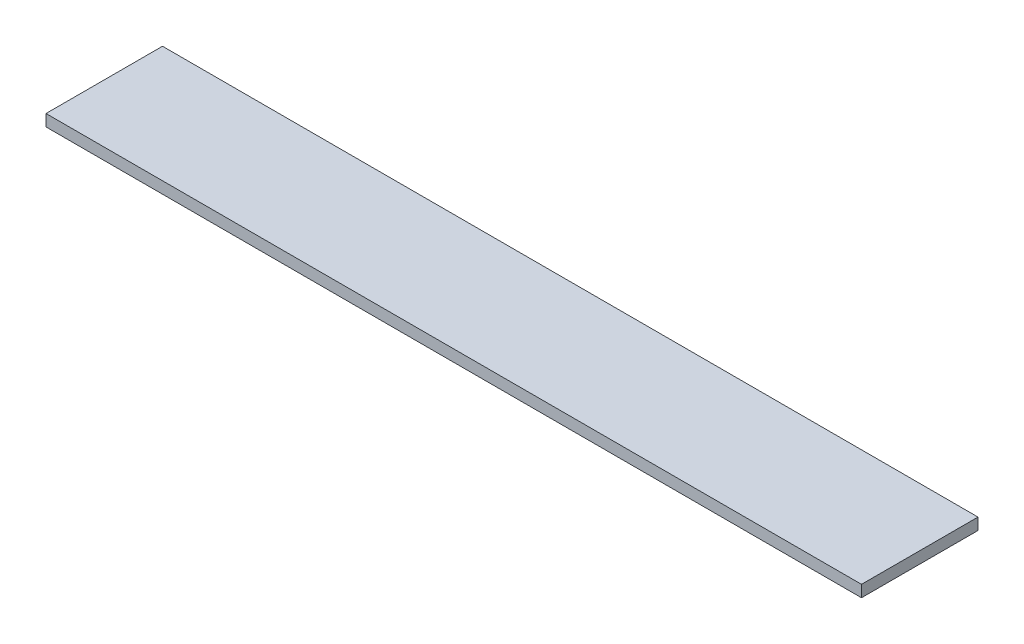
ISO-10303-21;
HEADER;
FILE_DESCRIPTION(('STEP AP214'),'2;1');
FILE_NAME('part.step','',(''),(''),'','','');
FILE_SCHEMA(('AUTOMOTIVE_DESIGN { 1 0 10303 214 1 1 1 1 }'));
ENDSEC;
DATA;
#1=APPLICATION_CONTEXT('core data for automotive mechanical design processes');
#2=APPLICATION_PROTOCOL_DEFINITION('international standard','automotive_design',2000,#1);
#3=PRODUCT_CONTEXT('',#1,'mechanical');
#4=PRODUCT('Part','Part','',(#3));
#5=PRODUCT_RELATED_PRODUCT_CATEGORY('part','',(#4));
#6=PRODUCT_DEFINITION_FORMATION('','',#4);
#7=PRODUCT_DEFINITION_CONTEXT('part definition',#1,'design');
#8=PRODUCT_DEFINITION('design','',#6,#7);
#9=PRODUCT_DEFINITION_SHAPE('','',#8);
#10=(LENGTH_UNIT() NAMED_UNIT(*) SI_UNIT(.MILLI.,.METRE.));
#11=(NAMED_UNIT(*) PLANE_ANGLE_UNIT() SI_UNIT($,.RADIAN.));
#12=(NAMED_UNIT(*) SI_UNIT($,.STERADIAN.) SOLID_ANGLE_UNIT());
#13=UNCERTAINTY_MEASURE_WITH_UNIT(LENGTH_MEASURE(1.E-05),#10,'distance_accuracy_value','');
#14=(GEOMETRIC_REPRESENTATION_CONTEXT(3) GLOBAL_UNCERTAINTY_ASSIGNED_CONTEXT((#13)) GLOBAL_UNIT_ASSIGNED_CONTEXT((#10,
#11,#12)) REPRESENTATION_CONTEXT('',''));
#15=CARTESIAN_POINT('',(0.,0.,0.));
#16=DIRECTION('',(0.,0.,1.));
#17=DIRECTION('',(1.,0.,0.));
#18=AXIS2_PLACEMENT_3D('',#15,#16,#17);
#19=CARTESIAN_POINT('',(-3500.,100.,-500.));
#20=DIRECTION('',(1.,0.,0.));
#21=DIRECTION('',(0.,0.,-1.));
#22=AXIS2_PLACEMENT_3D('',#19,#20,#21);
#23=PLANE('',#22);
#24=DIRECTION('',(0.,0.,1.));
#25=VECTOR('',#24,1.);
#26=CARTESIAN_POINT('',(-3500.,0.,-500.));
#27=LINE('',#26,#25);
#28=CARTESIAN_POINT('',(-3500.,0.,-500.));
#29=VERTEX_POINT('',#28);
#30=CARTESIAN_POINT('',(-3500.,0.,500.));
#31=VERTEX_POINT('',#30);
#32=EDGE_CURVE('E97',#29,#31,#27,.T.);
#33=ORIENTED_EDGE('',*,*,#32,.T.);
#34=DIRECTION('',(0.,-1.,0.));
#35=VECTOR('',#34,1.);
#36=CARTESIAN_POINT('',(-3500.,100.,500.));
#37=LINE('',#36,#35);
#38=CARTESIAN_POINT('',(-3500.,100.,500.));
#39=VERTEX_POINT('',#38);
#40=EDGE_CURVE('E11',#39,#31,#37,.T.);
#41=ORIENTED_EDGE('',*,*,#40,.F.);
#42=DIRECTION('',(0.,0.,1.));
#43=VECTOR('',#42,1.);
#44=CARTESIAN_POINT('',(-3500.,100.,-500.));
#45=LINE('',#44,#43);
#46=CARTESIAN_POINT('',(-3500.,100.,-500.));
#47=VERTEX_POINT('',#46);
#48=EDGE_CURVE('E85',#47,#39,#45,.T.);
#49=ORIENTED_EDGE('',*,*,#48,.F.);
#50=DIRECTION('',(0.,-1.,0.));
#51=VECTOR('',#50,1.);
#52=CARTESIAN_POINT('',(-3500.,100.,-500.));
#53=LINE('',#52,#51);
#54=EDGE_CURVE('E93',#47,#29,#53,.T.);
#55=ORIENTED_EDGE('',*,*,#54,.T.);
#56=EDGE_LOOP('',(#33,#41,#49,#55));
#57=FACE_BOUND('',#56,.T.);
#58=ADVANCED_FACE('F34',(#57),#23,.F.);
#59=CARTESIAN_POINT('',(-3500.,100.,500.));
#60=DIRECTION('',(0.,0.,-1.));
#61=DIRECTION('',(-1.,0.,0.));
#62=AXIS2_PLACEMENT_3D('',#59,#60,#61);
#63=PLANE('',#62);
#64=DIRECTION('',(1.,0.,0.));
#65=VECTOR('',#64,1.);
#66=CARTESIAN_POINT('',(-3500.,0.,500.));
#67=LINE('',#66,#65);
#68=CARTESIAN_POINT('',(3500.,0.,500.));
#69=VERTEX_POINT('',#68);
#70=EDGE_CURVE('E89',#31,#69,#67,.T.);
#71=ORIENTED_EDGE('',*,*,#70,.T.);
#72=DIRECTION('',(0.,-1.,0.));
#73=VECTOR('',#72,1.);
#74=CARTESIAN_POINT('',(3500.,100.,500.));
#75=LINE('',#74,#73);
#76=CARTESIAN_POINT('',(3500.,100.,500.));
#77=VERTEX_POINT('',#76);
#78=EDGE_CURVE('E42',#77,#69,#75,.T.);
#79=ORIENTED_EDGE('',*,*,#78,.F.);
#80=DIRECTION('',(1.,0.,0.));
#81=VECTOR('',#80,1.);
#82=CARTESIAN_POINT('',(-3500.,100.,500.));
#83=LINE('',#82,#81);
#84=EDGE_CURVE('E80',#39,#77,#83,.T.);
#85=ORIENTED_EDGE('',*,*,#84,.F.);
#86=ORIENTED_EDGE('',*,*,#40,.T.);
#87=EDGE_LOOP('',(#71,#79,#85,#86));
#88=FACE_BOUND('',#87,.T.);
#89=ADVANCED_FACE('F88',(#88),#63,.F.);
#90=CARTESIAN_POINT('',(3500.,100.,-500.));
#91=DIRECTION('',(-1.,0.,0.));
#92=DIRECTION('',(0.,0.,1.));
#93=AXIS2_PLACEMENT_3D('',#90,#91,#92);
#94=PLANE('',#93);
#95=DIRECTION('',(0.,0.,-1.));
#96=VECTOR('',#95,1.);
#97=CARTESIAN_POINT('',(3500.,0.,-500.));
#98=LINE('',#97,#96);
#99=CARTESIAN_POINT('',(3500.,0.,-500.));
#100=VERTEX_POINT('',#99);
#101=EDGE_CURVE('E67',#69,#100,#98,.T.);
#102=ORIENTED_EDGE('',*,*,#101,.T.);
#103=DIRECTION('',(0.,-1.,0.));
#104=VECTOR('',#103,1.);
#105=CARTESIAN_POINT('',(3500.,100.,-500.));
#106=LINE('',#105,#104);
#107=CARTESIAN_POINT('',(3500.,100.,-500.));
#108=VERTEX_POINT('',#107);
#109=EDGE_CURVE('E90',#108,#100,#106,.T.);
#110=ORIENTED_EDGE('',*,*,#109,.F.);
#111=DIRECTION('',(0.,0.,-1.));
#112=VECTOR('',#111,1.);
#113=CARTESIAN_POINT('',(3500.,100.,-500.));
#114=LINE('',#113,#112);
#115=EDGE_CURVE('E83',#77,#108,#114,.T.);
#116=ORIENTED_EDGE('',*,*,#115,.F.);
#117=ORIENTED_EDGE('',*,*,#78,.T.);
#118=EDGE_LOOP('',(#102,#110,#116,#117));
#119=FACE_BOUND('',#118,.T.);
#120=ADVANCED_FACE('F91',(#119),#94,.F.);
#121=CARTESIAN_POINT('',(-3500.,100.,-500.));
#122=DIRECTION('',(0.,0.,1.));
#123=DIRECTION('',(1.,0.,0.));
#124=AXIS2_PLACEMENT_3D('',#121,#122,#123);
#125=PLANE('',#124);
#126=DIRECTION('',(-1.,0.,0.));
#127=VECTOR('',#126,1.);
#128=CARTESIAN_POINT('',(-3500.,0.,-500.));
#129=LINE('',#128,#127);
#130=EDGE_CURVE('E73',#100,#29,#129,.T.);
#131=ORIENTED_EDGE('',*,*,#130,.T.);
#132=ORIENTED_EDGE('',*,*,#54,.F.);
#133=DIRECTION('',(-1.,0.,0.));
#134=VECTOR('',#133,1.);
#135=CARTESIAN_POINT('',(-3500.,100.,-500.));
#136=LINE('',#135,#134);
#137=EDGE_CURVE('E50',#108,#47,#136,.T.);
#138=ORIENTED_EDGE('',*,*,#137,.F.);
#139=ORIENTED_EDGE('',*,*,#109,.T.);
#140=EDGE_LOOP('',(#131,#132,#138,#139));
#141=FACE_BOUND('',#140,.T.);
#142=ADVANCED_FACE('F104',(#141),#125,.F.);
#143=CARTESIAN_POINT('',(-3500.,100.,500.));
#144=DIRECTION('',(0.,1.,0.));
#145=DIRECTION('',(0.,0.,1.));
#146=AXIS2_PLACEMENT_3D('',#143,#144,#145);
#147=PLANE('',#146);
#148=ORIENTED_EDGE('',*,*,#48,.T.);
#149=ORIENTED_EDGE('',*,*,#84,.T.);
#150=ORIENTED_EDGE('',*,*,#115,.T.);
#151=ORIENTED_EDGE('',*,*,#137,.T.);
#152=EDGE_LOOP('',(#148,#149,#150,#151));
#153=FACE_BOUND('',#152,.T.);
#154=ADVANCED_FACE('F81',(#153),#147,.T.);
#155=CARTESIAN_POINT('',(-3500.,0.,500.));
#156=DIRECTION('',(0.,1.,0.));
#157=DIRECTION('',(0.,0.,1.));
#158=AXIS2_PLACEMENT_3D('',#155,#156,#157);
#159=PLANE('',#158);
#160=ORIENTED_EDGE('',*,*,#32,.F.);
#161=ORIENTED_EDGE('',*,*,#130,.F.);
#162=ORIENTED_EDGE('',*,*,#101,.F.);
#163=ORIENTED_EDGE('',*,*,#70,.F.);
#164=EDGE_LOOP('',(#160,#161,#162,#163));
#165=FACE_BOUND('',#164,.T.);
#166=ADVANCED_FACE('F107',(#165),#159,.F.);
#167=CLOSED_SHELL('',(#58,#89,#120,#142,#154,#166));
#168=MANIFOLD_SOLID_BREP('B2',#167);
#169=ADVANCED_BREP_SHAPE_REPRESENTATION('',(#18,#168),#14);
#170=SHAPE_DEFINITION_REPRESENTATION(#9,#169);
ENDSEC;
END-ISO-10303-21;
